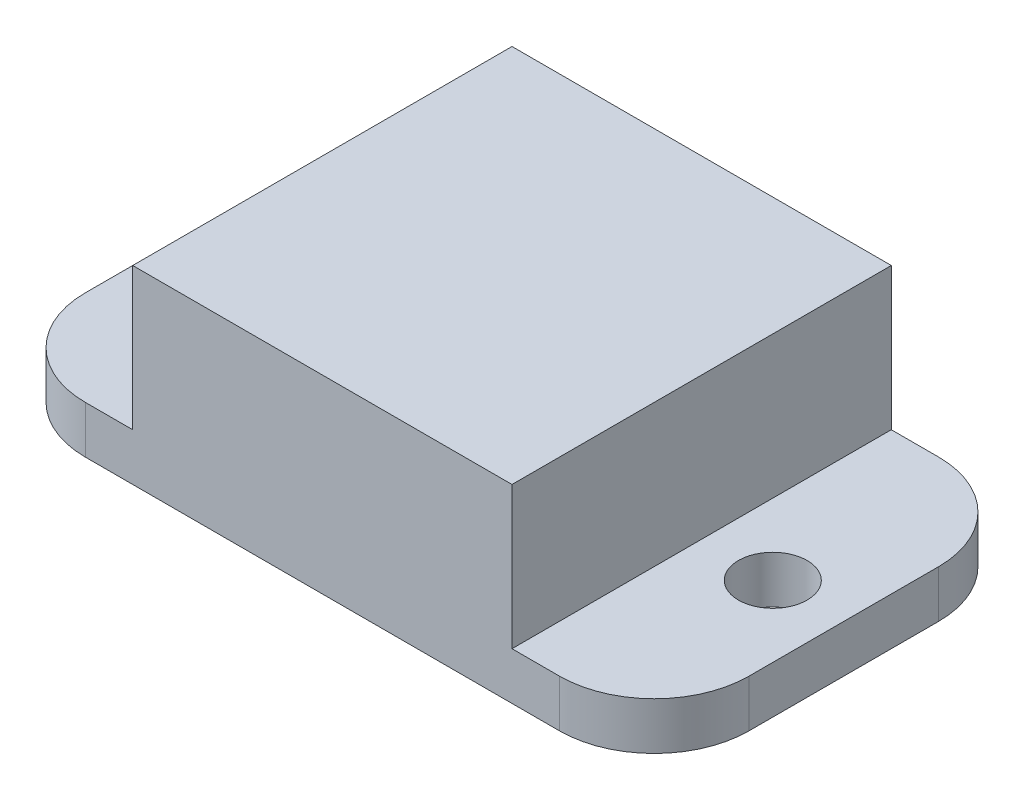
ISO-10303-21;
HEADER;
FILE_DESCRIPTION(('STEP AP214'),'2;1');
FILE_NAME('part.step','',(''),(''),'','','');
FILE_SCHEMA(('AUTOMOTIVE_DESIGN { 1 0 10303 214 1 1 1 1 }'));
ENDSEC;
DATA;
#1=APPLICATION_CONTEXT('core data for automotive mechanical design processes');
#2=APPLICATION_PROTOCOL_DEFINITION('international standard','automotive_design',2000,#1);
#3=PRODUCT_CONTEXT('',#1,'mechanical');
#4=PRODUCT('Part','Part','',(#3));
#5=PRODUCT_RELATED_PRODUCT_CATEGORY('part','',(#4));
#6=PRODUCT_DEFINITION_FORMATION('','',#4);
#7=PRODUCT_DEFINITION_CONTEXT('part definition',#1,'design');
#8=PRODUCT_DEFINITION('design','',#6,#7);
#9=PRODUCT_DEFINITION_SHAPE('','',#8);
#10=(LENGTH_UNIT() NAMED_UNIT(*) SI_UNIT(.MILLI.,.METRE.));
#11=(NAMED_UNIT(*) PLANE_ANGLE_UNIT() SI_UNIT($,.RADIAN.));
#12=(NAMED_UNIT(*) SI_UNIT($,.STERADIAN.) SOLID_ANGLE_UNIT());
#13=UNCERTAINTY_MEASURE_WITH_UNIT(LENGTH_MEASURE(1.E-05),#10,'distance_accuracy_value','');
#14=(GEOMETRIC_REPRESENTATION_CONTEXT(3) GLOBAL_UNCERTAINTY_ASSIGNED_CONTEXT((#13)) GLOBAL_UNIT_ASSIGNED_CONTEXT((#10,
#11,#12)) REPRESENTATION_CONTEXT('',''));
#15=CARTESIAN_POINT('',(0.,0.,0.));
#16=DIRECTION('',(0.,0.,1.));
#17=DIRECTION('',(1.,0.,0.));
#18=AXIS2_PLACEMENT_3D('',#15,#16,#17);
#19=CARTESIAN_POINT('',(44.45,0.,25.4));
#20=DIRECTION('',(0.,1.,0.));
#21=DIRECTION('',(0.,0.,1.));
#22=AXIS2_PLACEMENT_3D('',#19,#20,#21);
#23=PLANE('',#22);
#24=CARTESIAN_POINT('',(4.7625,0.,12.7));
#25=DIRECTION('',(0.,1.,0.));
#26=DIRECTION('',(0.,0.,1.));
#27=AXIS2_PLACEMENT_3D('',#24,#25,#26);
#28=CIRCLE('',#27,2.3);
#29=CARTESIAN_POINT('',(4.7625,0.,15.));
#30=VERTEX_POINT('',#29);
#31=EDGE_CURVE('E162',#30,#30,#28,.T.);
#32=ORIENTED_EDGE('',*,*,#31,.T.);
#33=EDGE_LOOP('',(#32));
#34=FACE_BOUND('',#33,.T.);
#35=CARTESIAN_POINT('',(39.6875,0.,12.7));
#36=DIRECTION('',(0.,1.,0.));
#37=DIRECTION('',(0.,0.,1.));
#38=AXIS2_PLACEMENT_3D('',#35,#36,#37);
#39=CIRCLE('',#38,2.3);
#40=CARTESIAN_POINT('',(39.6875,0.,15.));
#41=VERTEX_POINT('',#40);
#42=EDGE_CURVE('E287',#41,#41,#39,.T.);
#43=ORIENTED_EDGE('',*,*,#42,.T.);
#44=EDGE_LOOP('',(#43));
#45=FACE_BOUND('',#44,.T.);
#46=DIRECTION('',(0.,0.,-1.));
#47=VECTOR('',#46,1.);
#48=CARTESIAN_POINT('',(0.,0.,25.4));
#49=LINE('',#48,#47);
#50=CARTESIAN_POINT('',(0.,0.,19.05));
#51=VERTEX_POINT('',#50);
#52=CARTESIAN_POINT('',(0.,0.,6.35));
#53=VERTEX_POINT('',#52);
#54=EDGE_CURVE('E158',#51,#53,#49,.T.);
#55=ORIENTED_EDGE('',*,*,#54,.T.);
#56=CARTESIAN_POINT('',(6.35,0.,6.35));
#57=DIRECTION('',(0.,1.,0.));
#58=DIRECTION('',(0.,0.,1.));
#59=AXIS2_PLACEMENT_3D('',#56,#57,#58);
#60=CIRCLE('',#59,6.35);
#61=CARTESIAN_POINT('',(6.35,0.,0.));
#62=VERTEX_POINT('',#61);
#63=EDGE_CURVE('E200',#53,#62,#60,.F.);
#64=ORIENTED_EDGE('',*,*,#63,.T.);
#65=DIRECTION('',(1.,0.,0.));
#66=VECTOR('',#65,1.);
#67=CARTESIAN_POINT('',(44.45,0.,0.));
#68=LINE('',#67,#66);
#69=CARTESIAN_POINT('',(38.1,0.,0.));
#70=VERTEX_POINT('',#69);
#71=EDGE_CURVE('E159',#62,#70,#68,.T.);
#72=ORIENTED_EDGE('',*,*,#71,.T.);
#73=CARTESIAN_POINT('',(38.1,0.,6.35));
#74=DIRECTION('',(0.,1.,0.));
#75=DIRECTION('',(0.,0.,1.));
#76=AXIS2_PLACEMENT_3D('',#73,#74,#75);
#77=CIRCLE('',#76,6.35);
#78=CARTESIAN_POINT('',(44.45,0.,6.35));
#79=VERTEX_POINT('',#78);
#80=EDGE_CURVE('E196',#70,#79,#77,.F.);
#81=ORIENTED_EDGE('',*,*,#80,.T.);
#82=DIRECTION('',(0.,0.,-1.));
#83=VECTOR('',#82,1.);
#84=CARTESIAN_POINT('',(44.45,0.,25.4));
#85=LINE('',#84,#83);
#86=CARTESIAN_POINT('',(44.45,0.,19.05));
#87=VERTEX_POINT('',#86);
#88=EDGE_CURVE('E186',#87,#79,#85,.T.);
#89=ORIENTED_EDGE('',*,*,#88,.F.);
#90=CARTESIAN_POINT('',(38.1,0.,19.05));
#91=DIRECTION('',(0.,1.,0.));
#92=DIRECTION('',(0.,0.,1.));
#93=AXIS2_PLACEMENT_3D('',#90,#91,#92);
#94=CIRCLE('',#93,6.35);
#95=CARTESIAN_POINT('',(38.1,0.,25.4));
#96=VERTEX_POINT('',#95);
#97=EDGE_CURVE('E194',#87,#96,#94,.F.);
#98=ORIENTED_EDGE('',*,*,#97,.T.);
#99=DIRECTION('',(1.,0.,0.));
#100=VECTOR('',#99,1.);
#101=CARTESIAN_POINT('',(44.45,0.,25.4));
#102=LINE('',#101,#100);
#103=CARTESIAN_POINT('',(6.35,0.,25.4));
#104=VERTEX_POINT('',#103);
#105=EDGE_CURVE('E134',#104,#96,#102,.T.);
#106=ORIENTED_EDGE('',*,*,#105,.F.);
#107=CARTESIAN_POINT('',(6.35,0.,19.05));
#108=DIRECTION('',(0.,1.,0.));
#109=DIRECTION('',(0.,0.,1.));
#110=AXIS2_PLACEMENT_3D('',#107,#108,#109);
#111=CIRCLE('',#110,6.35);
#112=EDGE_CURVE('E198',#104,#51,#111,.F.);
#113=ORIENTED_EDGE('',*,*,#112,.T.);
#114=EDGE_LOOP('',(#55,#64,#72,#81,#89,#98,#106,#113));
#115=FACE_BOUND('',#114,.T.);
#116=ADVANCED_FACE('F37',(#34,#45,#115),#23,.F.);
#117=CARTESIAN_POINT('',(44.45,3.175,25.4));
#118=DIRECTION('',(-1.,0.,0.));
#119=DIRECTION('',(0.,0.,1.));
#120=AXIS2_PLACEMENT_3D('',#117,#118,#119);
#121=PLANE('',#120);
#122=ORIENTED_EDGE('',*,*,#88,.T.);
#123=DIRECTION('',(0.,1.,0.));
#124=VECTOR('',#123,1.);
#125=CARTESIAN_POINT('',(44.45,3.175,6.35));
#126=LINE('',#125,#124);
#127=CARTESIAN_POINT('',(44.45,3.175,6.35));
#128=VERTEX_POINT('',#127);
#129=EDGE_CURVE('E216',#79,#128,#126,.T.);
#130=ORIENTED_EDGE('',*,*,#129,.T.);
#131=DIRECTION('',(0.,0.,-1.));
#132=VECTOR('',#131,1.);
#133=CARTESIAN_POINT('',(44.45,3.175,25.4));
#134=LINE('',#133,#132);
#135=CARTESIAN_POINT('',(44.45,3.175,19.05));
#136=VERTEX_POINT('',#135);
#137=EDGE_CURVE('E143',#136,#128,#134,.T.);
#138=ORIENTED_EDGE('',*,*,#137,.F.);
#139=DIRECTION('',(0.,1.,0.));
#140=VECTOR('',#139,1.);
#141=CARTESIAN_POINT('',(44.45,3.175,19.05));
#142=LINE('',#141,#140);
#143=EDGE_CURVE('E214',#136,#87,#142,.F.);
#144=ORIENTED_EDGE('',*,*,#143,.T.);
#145=EDGE_LOOP('',(#122,#130,#138,#144));
#146=FACE_BOUND('',#145,.T.);
#147=ADVANCED_FACE('F218',(#146),#121,.F.);
#148=CARTESIAN_POINT('',(34.925,3.17499999999999,25.4));
#149=DIRECTION('',(0.,-1.,0.));
#150=DIRECTION('',(1.,0.,0.));
#151=AXIS2_PLACEMENT_3D('',#148,#149,#150);
#152=PLANE('',#151);
#153=CARTESIAN_POINT('',(39.6875,3.17499999999999,12.7));
#154=DIRECTION('',(0.,1.,0.));
#155=DIRECTION('',(0.,0.,1.));
#156=AXIS2_PLACEMENT_3D('',#153,#154,#155);
#157=CIRCLE('',#156,2.3);
#158=CARTESIAN_POINT('',(39.6875,3.17499999999999,15.));
#159=VERTEX_POINT('',#158);
#160=EDGE_CURVE('E290',#159,#159,#157,.T.);
#161=ORIENTED_EDGE('',*,*,#160,.F.);
#162=EDGE_LOOP('',(#161));
#163=FACE_BOUND('',#162,.T.);
#164=ORIENTED_EDGE('',*,*,#137,.T.);
#165=CARTESIAN_POINT('',(38.1,3.17499999999999,6.35));
#166=DIRECTION('',(0.,-1.,0.));
#167=DIRECTION('',(1.,0.,0.));
#168=AXIS2_PLACEMENT_3D('',#165,#166,#167);
#169=CIRCLE('',#168,6.35);
#170=CARTESIAN_POINT('',(38.1,3.17499999999999,0.));
#171=VERTEX_POINT('',#170);
#172=EDGE_CURVE('E11',#128,#171,#169,.F.);
#173=ORIENTED_EDGE('',*,*,#172,.T.);
#174=DIRECTION('',(-1.,0.,0.));
#175=VECTOR('',#174,1.);
#176=CARTESIAN_POINT('',(34.925,3.17499999999999,0.));
#177=LINE('',#176,#175);
#178=CARTESIAN_POINT('',(34.925,3.17499999999999,0.));
#179=VERTEX_POINT('',#178);
#180=EDGE_CURVE('E140',#171,#179,#177,.T.);
#181=ORIENTED_EDGE('',*,*,#180,.T.);
#182=DIRECTION('',(0.,0.,-1.));
#183=VECTOR('',#182,1.);
#184=CARTESIAN_POINT('',(34.925,3.17499999999999,25.4));
#185=LINE('',#184,#183);
#186=CARTESIAN_POINT('',(34.925,3.17499999999999,25.4));
#187=VERTEX_POINT('',#186);
#188=EDGE_CURVE('E137',#187,#179,#185,.T.);
#189=ORIENTED_EDGE('',*,*,#188,.F.);
#190=DIRECTION('',(-1.,0.,0.));
#191=VECTOR('',#190,1.);
#192=CARTESIAN_POINT('',(34.925,3.17499999999999,25.4));
#193=LINE('',#192,#191);
#194=CARTESIAN_POINT('',(38.1,3.17499999999999,25.4));
#195=VERTEX_POINT('',#194);
#196=EDGE_CURVE('E124',#195,#187,#193,.T.);
#197=ORIENTED_EDGE('',*,*,#196,.F.);
#198=CARTESIAN_POINT('',(38.1,3.17499999999999,19.05));
#199=DIRECTION('',(0.,-1.,0.));
#200=DIRECTION('',(1.,0.,0.));
#201=AXIS2_PLACEMENT_3D('',#198,#199,#200);
#202=CIRCLE('',#201,6.35);
#203=EDGE_CURVE('E45',#195,#136,#202,.F.);
#204=ORIENTED_EDGE('',*,*,#203,.T.);
#205=EDGE_LOOP('',(#164,#173,#181,#189,#197,#204));
#206=FACE_BOUND('',#205,.T.);
#207=ADVANCED_FACE('F138',(#163,#206),#152,.F.);
#208=CARTESIAN_POINT('',(34.925,12.7,25.4));
#209=DIRECTION('',(-1.,0.,0.));
#210=DIRECTION('',(0.,0.,1.));
#211=AXIS2_PLACEMENT_3D('',#208,#209,#210);
#212=PLANE('',#211);
#213=DIRECTION('',(0.,1.,0.));
#214=VECTOR('',#213,1.);
#215=CARTESIAN_POINT('',(34.925,12.7,0.));
#216=LINE('',#215,#214);
#217=CARTESIAN_POINT('',(34.925,12.7,0.));
#218=VERTEX_POINT('',#217);
#219=EDGE_CURVE('E164',#179,#218,#216,.T.);
#220=ORIENTED_EDGE('',*,*,#219,.T.);
#221=DIRECTION('',(0.,0.,-1.));
#222=VECTOR('',#221,1.);
#223=CARTESIAN_POINT('',(34.925,12.7,25.4));
#224=LINE('',#223,#222);
#225=CARTESIAN_POINT('',(34.925,12.7,25.4));
#226=VERTEX_POINT('',#225);
#227=EDGE_CURVE('E144',#226,#218,#224,.T.);
#228=ORIENTED_EDGE('',*,*,#227,.F.);
#229=DIRECTION('',(0.,1.,0.));
#230=VECTOR('',#229,1.);
#231=CARTESIAN_POINT('',(34.925,12.7,25.4));
#232=LINE('',#231,#230);
#233=EDGE_CURVE('E129',#187,#226,#232,.T.);
#234=ORIENTED_EDGE('',*,*,#233,.F.);
#235=ORIENTED_EDGE('',*,*,#188,.T.);
#236=EDGE_LOOP('',(#220,#228,#234,#235));
#237=FACE_BOUND('',#236,.T.);
#238=ADVANCED_FACE('F146',(#237),#212,.F.);
#239=CARTESIAN_POINT('',(9.525,12.7,25.4));
#240=DIRECTION('',(0.,-1.,0.));
#241=DIRECTION('',(0.,0.,-1.));
#242=AXIS2_PLACEMENT_3D('',#239,#240,#241);
#243=PLANE('',#242);
#244=DIRECTION('',(-1.,0.,0.));
#245=VECTOR('',#244,1.);
#246=CARTESIAN_POINT('',(9.525,12.7,0.));
#247=LINE('',#246,#245);
#248=CARTESIAN_POINT('',(9.525,12.7,0.));
#249=VERTEX_POINT('',#248);
#250=EDGE_CURVE('E166',#218,#249,#247,.T.);
#251=ORIENTED_EDGE('',*,*,#250,.T.);
#252=DIRECTION('',(0.,0.,-1.));
#253=VECTOR('',#252,1.);
#254=CARTESIAN_POINT('',(9.525,12.7,25.4));
#255=LINE('',#254,#253);
#256=CARTESIAN_POINT('',(9.525,12.7,25.4));
#257=VERTEX_POINT('',#256);
#258=EDGE_CURVE('E181',#257,#249,#255,.T.);
#259=ORIENTED_EDGE('',*,*,#258,.F.);
#260=DIRECTION('',(-1.,0.,0.));
#261=VECTOR('',#260,1.);
#262=CARTESIAN_POINT('',(9.525,12.7,25.4));
#263=LINE('',#262,#261);
#264=EDGE_CURVE('E149',#226,#257,#263,.T.);
#265=ORIENTED_EDGE('',*,*,#264,.F.);
#266=ORIENTED_EDGE('',*,*,#227,.T.);
#267=EDGE_LOOP('',(#251,#259,#265,#266));
#268=FACE_BOUND('',#267,.T.);
#269=ADVANCED_FACE('F255',(#268),#243,.F.);
#270=CARTESIAN_POINT('',(9.525,3.17499999999999,25.4));
#271=DIRECTION('',(1.,0.,0.));
#272=DIRECTION('',(0.,1.,0.));
#273=AXIS2_PLACEMENT_3D('',#270,#271,#272);
#274=PLANE('',#273);
#275=DIRECTION('',(0.,-1.,0.));
#276=VECTOR('',#275,1.);
#277=CARTESIAN_POINT('',(9.525,3.17499999999999,0.));
#278=LINE('',#277,#276);
#279=CARTESIAN_POINT('',(9.525,3.17499999999999,0.));
#280=VERTEX_POINT('',#279);
#281=EDGE_CURVE('E168',#249,#280,#278,.T.);
#282=ORIENTED_EDGE('',*,*,#281,.T.);
#283=DIRECTION('',(0.,0.,-1.));
#284=VECTOR('',#283,1.);
#285=CARTESIAN_POINT('',(9.525,3.17499999999999,25.4));
#286=LINE('',#285,#284);
#287=CARTESIAN_POINT('',(9.525,3.17499999999999,25.4));
#288=VERTEX_POINT('',#287);
#289=EDGE_CURVE('E178',#288,#280,#286,.T.);
#290=ORIENTED_EDGE('',*,*,#289,.F.);
#291=DIRECTION('',(0.,-1.,0.));
#292=VECTOR('',#291,1.);
#293=CARTESIAN_POINT('',(9.525,3.17499999999999,25.4));
#294=LINE('',#293,#292);
#295=EDGE_CURVE('E151',#257,#288,#294,.T.);
#296=ORIENTED_EDGE('',*,*,#295,.F.);
#297=ORIENTED_EDGE('',*,*,#258,.T.);
#298=EDGE_LOOP('',(#282,#290,#296,#297));
#299=FACE_BOUND('',#298,.T.);
#300=ADVANCED_FACE('F252',(#299),#274,.F.);
#301=CARTESIAN_POINT('',(0.,3.17499999999999,25.4));
#302=DIRECTION('',(0.,-1.,0.));
#303=DIRECTION('',(0.,0.,-1.));
#304=AXIS2_PLACEMENT_3D('',#301,#302,#303);
#305=PLANE('',#304);
#306=CARTESIAN_POINT('',(4.7625,3.17499999999999,12.7));
#307=DIRECTION('',(0.,1.,0.));
#308=DIRECTION('',(0.,0.,1.));
#309=AXIS2_PLACEMENT_3D('',#306,#307,#308);
#310=CIRCLE('',#309,2.3);
#311=CARTESIAN_POINT('',(4.7625,3.17499999999999,15.));
#312=VERTEX_POINT('',#311);
#313=EDGE_CURVE('E293',#312,#312,#310,.T.);
#314=ORIENTED_EDGE('',*,*,#313,.F.);
#315=EDGE_LOOP('',(#314));
#316=FACE_BOUND('',#315,.T.);
#317=DIRECTION('',(-1.,0.,0.));
#318=VECTOR('',#317,1.);
#319=CARTESIAN_POINT('',(0.,3.17499999999999,0.));
#320=LINE('',#319,#318);
#321=CARTESIAN_POINT('',(6.35,3.17499999999999,0.));
#322=VERTEX_POINT('',#321);
#323=EDGE_CURVE('E170',#280,#322,#320,.T.);
#324=ORIENTED_EDGE('',*,*,#323,.T.);
#325=CARTESIAN_POINT('',(6.35,3.17499999999999,6.35));
#326=DIRECTION('',(0.,-1.,0.));
#327=DIRECTION('',(0.,0.,-1.));
#328=AXIS2_PLACEMENT_3D('',#325,#326,#327);
#329=CIRCLE('',#328,6.35);
#330=CARTESIAN_POINT('',(0.,3.17499999999999,6.35));
#331=VERTEX_POINT('',#330);
#332=EDGE_CURVE('E208',#322,#331,#329,.F.);
#333=ORIENTED_EDGE('',*,*,#332,.T.);
#334=DIRECTION('',(0.,0.,-1.));
#335=VECTOR('',#334,1.);
#336=CARTESIAN_POINT('',(0.,3.17499999999999,25.4));
#337=LINE('',#336,#335);
#338=CARTESIAN_POINT('',(0.,3.17499999999999,19.05));
#339=VERTEX_POINT('',#338);
#340=EDGE_CURVE('E175',#339,#331,#337,.T.);
#341=ORIENTED_EDGE('',*,*,#340,.F.);
#342=CARTESIAN_POINT('',(6.35,3.17499999999999,19.05));
#343=DIRECTION('',(0.,-1.,0.));
#344=DIRECTION('',(0.,0.,-1.));
#345=AXIS2_PLACEMENT_3D('',#342,#343,#344);
#346=CIRCLE('',#345,6.35);
#347=CARTESIAN_POINT('',(6.35,3.17499999999999,25.4));
#348=VERTEX_POINT('',#347);
#349=EDGE_CURVE('E206',#339,#348,#346,.F.);
#350=ORIENTED_EDGE('',*,*,#349,.T.);
#351=DIRECTION('',(-1.,0.,0.));
#352=VECTOR('',#351,1.);
#353=CARTESIAN_POINT('',(0.,3.17499999999999,25.4));
#354=LINE('',#353,#352);
#355=EDGE_CURVE('E156',#288,#348,#354,.T.);
#356=ORIENTED_EDGE('',*,*,#355,.F.);
#357=ORIENTED_EDGE('',*,*,#289,.T.);
#358=EDGE_LOOP('',(#324,#333,#341,#350,#356,#357));
#359=FACE_BOUND('',#358,.T.);
#360=ADVANCED_FACE('F237',(#316,#359),#305,.F.);
#361=CARTESIAN_POINT('',(0.,0.,25.4));
#362=DIRECTION('',(1.,0.,0.));
#363=DIRECTION('',(0.,0.,-1.));
#364=AXIS2_PLACEMENT_3D('',#361,#362,#363);
#365=PLANE('',#364);
#366=ORIENTED_EDGE('',*,*,#340,.T.);
#367=DIRECTION('',(0.,-1.,0.));
#368=VECTOR('',#367,1.);
#369=CARTESIAN_POINT('',(0.,0.,6.35));
#370=LINE('',#369,#368);
#371=EDGE_CURVE('E191',#331,#53,#370,.T.);
#372=ORIENTED_EDGE('',*,*,#371,.T.);
#373=ORIENTED_EDGE('',*,*,#54,.F.);
#374=DIRECTION('',(0.,-1.,0.));
#375=VECTOR('',#374,1.);
#376=CARTESIAN_POINT('',(0.,0.,19.05));
#377=LINE('',#376,#375);
#378=EDGE_CURVE('E189',#51,#339,#377,.F.);
#379=ORIENTED_EDGE('',*,*,#378,.T.);
#380=EDGE_LOOP('',(#366,#372,#373,#379));
#381=FACE_BOUND('',#380,.T.);
#382=ADVANCED_FACE('F240',(#381),#365,.F.);
#383=CARTESIAN_POINT('',(0.,0.,25.4));
#384=DIRECTION('',(0.,0.,-1.));
#385=DIRECTION('',(-1.,0.,0.));
#386=AXIS2_PLACEMENT_3D('',#383,#384,#385);
#387=PLANE('',#386);
#388=ORIENTED_EDGE('',*,*,#355,.T.);
#389=DIRECTION('',(0.,-1.,0.));
#390=VECTOR('',#389,1.);
#391=CARTESIAN_POINT('',(6.35,0.,25.4));
#392=LINE('',#391,#390);
#393=EDGE_CURVE('E211',#348,#104,#392,.T.);
#394=ORIENTED_EDGE('',*,*,#393,.T.);
#395=ORIENTED_EDGE('',*,*,#105,.T.);
#396=DIRECTION('',(0.,1.,0.));
#397=VECTOR('',#396,1.);
#398=CARTESIAN_POINT('',(38.1,0.,25.4));
#399=LINE('',#398,#397);
#400=EDGE_CURVE('E133',#96,#195,#399,.T.);
#401=ORIENTED_EDGE('',*,*,#400,.T.);
#402=ORIENTED_EDGE('',*,*,#196,.T.);
#403=ORIENTED_EDGE('',*,*,#233,.T.);
#404=ORIENTED_EDGE('',*,*,#264,.T.);
#405=ORIENTED_EDGE('',*,*,#295,.T.);
#406=EDGE_LOOP('',(#388,#394,#395,#401,#402,#403,#404,#405));
#407=FACE_BOUND('',#406,.T.);
#408=ADVANCED_FACE('F127',(#407),#387,.F.);
#409=CARTESIAN_POINT('',(0.,0.,0.));
#410=DIRECTION('',(0.,0.,-1.));
#411=DIRECTION('',(-1.,0.,0.));
#412=AXIS2_PLACEMENT_3D('',#409,#410,#411);
#413=PLANE('',#412);
#414=ORIENTED_EDGE('',*,*,#71,.F.);
#415=DIRECTION('',(0.,-1.,0.));
#416=VECTOR('',#415,1.);
#417=CARTESIAN_POINT('',(6.35,3.17499999999999,0.));
#418=LINE('',#417,#416);
#419=EDGE_CURVE('E204',#62,#322,#418,.F.);
#420=ORIENTED_EDGE('',*,*,#419,.T.);
#421=ORIENTED_EDGE('',*,*,#323,.F.);
#422=ORIENTED_EDGE('',*,*,#281,.F.);
#423=ORIENTED_EDGE('',*,*,#250,.F.);
#424=ORIENTED_EDGE('',*,*,#219,.F.);
#425=ORIENTED_EDGE('',*,*,#180,.F.);
#426=DIRECTION('',(0.,1.,0.));
#427=VECTOR('',#426,1.);
#428=CARTESIAN_POINT('',(38.1,0.,0.));
#429=LINE('',#428,#427);
#430=EDGE_CURVE('E202',#171,#70,#429,.F.);
#431=ORIENTED_EDGE('',*,*,#430,.T.);
#432=EDGE_LOOP('',(#414,#420,#421,#422,#423,#424,#425,#431));
#433=FACE_BOUND('',#432,.T.);
#434=ADVANCED_FACE('F224',(#433),#413,.T.);
#435=CARTESIAN_POINT('',(4.7625,0.,12.7));
#436=DIRECTION('',(0.,1.,0.));
#437=DIRECTION('',(0.,0.,1.));
#438=AXIS2_PLACEMENT_3D('',#435,#436,#437);
#439=CYLINDRICAL_SURFACE('',#438,2.3);
#440=ORIENTED_EDGE('',*,*,#31,.F.);
#441=EDGE_LOOP('',(#440));
#442=FACE_BOUND('',#441,.T.);
#443=ORIENTED_EDGE('',*,*,#313,.T.);
#444=EDGE_LOOP('',(#443));
#445=FACE_BOUND('',#444,.T.);
#446=ADVANCED_FACE('F298',(#442,#445),#439,.F.);
#447=CARTESIAN_POINT('',(39.6875,0.,12.7));
#448=DIRECTION('',(0.,1.,0.));
#449=DIRECTION('',(0.,0.,1.));
#450=AXIS2_PLACEMENT_3D('',#447,#448,#449);
#451=CYLINDRICAL_SURFACE('',#450,2.3);
#452=ORIENTED_EDGE('',*,*,#42,.F.);
#453=EDGE_LOOP('',(#452));
#454=FACE_BOUND('',#453,.T.);
#455=ORIENTED_EDGE('',*,*,#160,.T.);
#456=EDGE_LOOP('',(#455));
#457=FACE_BOUND('',#456,.T.);
#458=ADVANCED_FACE('F277',(#454,#457),#451,.F.);
#459=CARTESIAN_POINT('',(6.35,0.,6.35));
#460=DIRECTION('',(0.,1.,0.));
#461=DIRECTION('',(0.,0.,1.));
#462=AXIS2_PLACEMENT_3D('',#459,#460,#461);
#463=CYLINDRICAL_SURFACE('',#462,6.35);
#464=ORIENTED_EDGE('',*,*,#332,.F.);
#465=ORIENTED_EDGE('',*,*,#419,.F.);
#466=ORIENTED_EDGE('',*,*,#63,.F.);
#467=ORIENTED_EDGE('',*,*,#371,.F.);
#468=EDGE_LOOP('',(#464,#465,#466,#467));
#469=FACE_BOUND('',#468,.T.);
#470=ADVANCED_FACE('F233',(#469),#463,.T.);
#471=CARTESIAN_POINT('',(6.35,0.,19.05));
#472=DIRECTION('',(0.,-1.,0.));
#473=DIRECTION('',(0.,0.,-1.));
#474=AXIS2_PLACEMENT_3D('',#471,#472,#473);
#475=CYLINDRICAL_SURFACE('',#474,6.35);
#476=ORIENTED_EDGE('',*,*,#349,.F.);
#477=ORIENTED_EDGE('',*,*,#378,.F.);
#478=ORIENTED_EDGE('',*,*,#112,.F.);
#479=ORIENTED_EDGE('',*,*,#393,.F.);
#480=EDGE_LOOP('',(#476,#477,#478,#479));
#481=FACE_BOUND('',#480,.T.);
#482=ADVANCED_FACE('F244',(#481),#475,.T.);
#483=CARTESIAN_POINT('',(38.1,3.175,6.35));
#484=DIRECTION('',(0.,-1.,0.));
#485=DIRECTION('',(0.,0.,-1.));
#486=AXIS2_PLACEMENT_3D('',#483,#484,#485);
#487=CYLINDRICAL_SURFACE('',#486,6.35);
#488=ORIENTED_EDGE('',*,*,#80,.F.);
#489=ORIENTED_EDGE('',*,*,#430,.F.);
#490=ORIENTED_EDGE('',*,*,#172,.F.);
#491=ORIENTED_EDGE('',*,*,#129,.F.);
#492=EDGE_LOOP('',(#488,#489,#490,#491));
#493=FACE_BOUND('',#492,.T.);
#494=ADVANCED_FACE('F226',(#493),#487,.T.);
#495=CARTESIAN_POINT('',(38.1,0.,19.05));
#496=DIRECTION('',(0.,1.,0.));
#497=DIRECTION('',(0.,0.,1.));
#498=AXIS2_PLACEMENT_3D('',#495,#496,#497);
#499=CYLINDRICAL_SURFACE('',#498,6.35);
#500=ORIENTED_EDGE('',*,*,#97,.F.);
#501=ORIENTED_EDGE('',*,*,#143,.F.);
#502=ORIENTED_EDGE('',*,*,#203,.F.);
#503=ORIENTED_EDGE('',*,*,#400,.F.);
#504=EDGE_LOOP('',(#500,#501,#502,#503));
#505=FACE_BOUND('',#504,.T.);
#506=ADVANCED_FACE('F39',(#505),#499,.T.);
#507=CLOSED_SHELL('',(#116,#147,#207,#238,#269,#300,#360,#382,#408,#434,#446,#458,#470,#482,
#494,#506));
#508=MANIFOLD_SOLID_BREP('B2',#507);
#509=ADVANCED_BREP_SHAPE_REPRESENTATION('',(#18,#508),#14);
#510=SHAPE_DEFINITION_REPRESENTATION(#9,#509);
ENDSEC;
END-ISO-10303-21;
